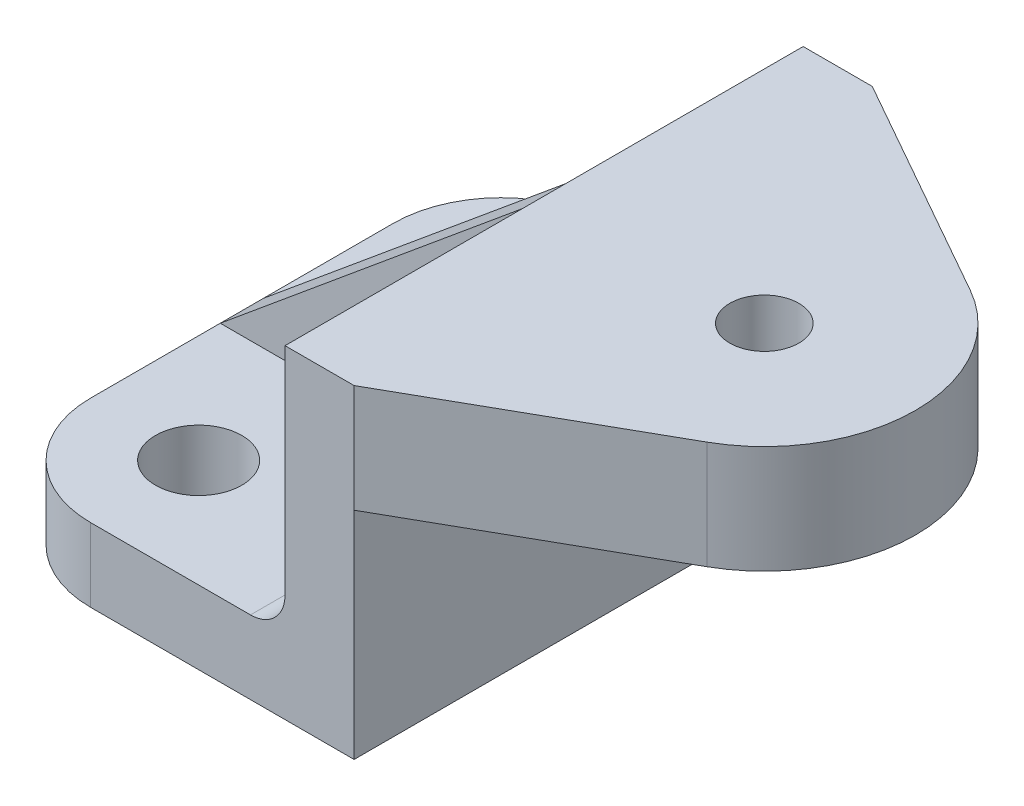
ISO-10303-21;
HEADER;
FILE_DESCRIPTION(('STEP AP214'),'2;1');
FILE_NAME('part.step','',(''),(''),'','','');
FILE_SCHEMA(('AUTOMOTIVE_DESIGN { 1 0 10303 214 1 1 1 1 }'));
ENDSEC;
DATA;
#1=APPLICATION_CONTEXT('core data for automotive mechanical design processes');
#2=APPLICATION_PROTOCOL_DEFINITION('international standard','automotive_design',2000,#1);
#3=PRODUCT_CONTEXT('',#1,'mechanical');
#4=PRODUCT('Part','Part','',(#3));
#5=PRODUCT_RELATED_PRODUCT_CATEGORY('part','',(#4));
#6=PRODUCT_DEFINITION_FORMATION('','',#4);
#7=PRODUCT_DEFINITION_CONTEXT('part definition',#1,'design');
#8=PRODUCT_DEFINITION('design','',#6,#7);
#9=PRODUCT_DEFINITION_SHAPE('','',#8);
#10=(LENGTH_UNIT() NAMED_UNIT(*) SI_UNIT(.MILLI.,.METRE.));
#11=(NAMED_UNIT(*) PLANE_ANGLE_UNIT() SI_UNIT($,.RADIAN.));
#12=(NAMED_UNIT(*) SI_UNIT($,.STERADIAN.) SOLID_ANGLE_UNIT());
#13=UNCERTAINTY_MEASURE_WITH_UNIT(LENGTH_MEASURE(1.E-05),#10,'distance_accuracy_value','');
#14=(GEOMETRIC_REPRESENTATION_CONTEXT(3) GLOBAL_UNCERTAINTY_ASSIGNED_CONTEXT((#13)) GLOBAL_UNIT_ASSIGNED_CONTEXT((#10,
#11,#12)) REPRESENTATION_CONTEXT('',''));
#15=CARTESIAN_POINT('',(0.,0.,0.));
#16=DIRECTION('',(0.,0.,1.));
#17=DIRECTION('',(1.,0.,0.));
#18=AXIS2_PLACEMENT_3D('',#15,#16,#17);
#19=CARTESIAN_POINT('',(70.,75.,-65.));
#20=DIRECTION('',(-0.638017864750323,0.770021560905562,0.));
#21=DIRECTION('',(-0.770021560905562,-0.638017864750323,0.));
#22=AXIS2_PLACEMENT_3D('',#19,#20,#21);
#23=PLANE('',#22);
#24=DIRECTION('',(0.,0.,1.));
#25=VECTOR('',#24,1.);
#26=CARTESIAN_POINT('',(0.,17.,-65.));
#27=LINE('',#26,#25);
#28=CARTESIAN_POINT('',(0.,17.,-65.));
#29=VERTEX_POINT('',#28);
#30=CARTESIAN_POINT('',(0.,17.,-55.));
#31=VERTEX_POINT('',#30);
#32=EDGE_CURVE('E180',#29,#31,#27,.T.);
#33=ORIENTED_EDGE('',*,*,#32,.T.);
#34=DIRECTION('',(-0.770021560905562,-0.638017864750323,0.));
#35=VECTOR('',#34,1.);
#36=CARTESIAN_POINT('',(0.,17.,-55.));
#37=LINE('',#36,#35);
#38=CARTESIAN_POINT('',(70.,75.,-55.));
#39=VERTEX_POINT('',#38);
#40=EDGE_CURVE('E166',#39,#31,#37,.T.);
#41=ORIENTED_EDGE('',*,*,#40,.F.);
#42=DIRECTION('',(0.,0.,1.));
#43=VECTOR('',#42,1.);
#44=CARTESIAN_POINT('',(70.,75.,-65.));
#45=LINE('',#44,#43);
#46=CARTESIAN_POINT('',(70.,75.,-65.));
#47=VERTEX_POINT('',#46);
#48=EDGE_CURVE('E194',#47,#39,#45,.T.);
#49=ORIENTED_EDGE('',*,*,#48,.F.);
#50=DIRECTION('',(-0.770021560905562,-0.638017864750323,0.));
#51=VECTOR('',#50,1.);
#52=CARTESIAN_POINT('',(70.,75.,-65.));
#53=LINE('',#52,#51);
#54=EDGE_CURVE('E190',#47,#29,#53,.T.);
#55=ORIENTED_EDGE('',*,*,#54,.T.);
#56=EDGE_LOOP('',(#33,#41,#49,#55));
#57=FACE_BOUND('',#56,.T.);
#58=ADVANCED_FACE('F43',(#57),#23,.T.);
#59=CARTESIAN_POINT('',(86.,0.,0.));
#60=DIRECTION('',(-1.,0.,0.));
#61=DIRECTION('',(0.,0.,1.));
#62=AXIS2_PLACEMENT_3D('',#59,#60,#61);
#63=PLANE('',#62);
#64=DIRECTION('',(0.,0.,-1.));
#65=VECTOR('',#64,1.);
#66=CARTESIAN_POINT('',(86.,50.,0.));
#67=LINE('',#66,#65);
#68=CARTESIAN_POINT('',(86.,50.,0.));
#69=VERTEX_POINT('',#68);
#70=CARTESIAN_POINT('',(86.,50.,-120.));
#71=VERTEX_POINT('',#70);
#72=EDGE_CURVE('E210',#69,#71,#67,.T.);
#73=ORIENTED_EDGE('',*,*,#72,.F.);
#74=DIRECTION('',(0.,-1.,0.));
#75=VECTOR('',#74,1.);
#76=CARTESIAN_POINT('',(86.,0.,0.));
#77=LINE('',#76,#75);
#78=CARTESIAN_POINT('',(86.,0.,0.));
#79=VERTEX_POINT('',#78);
#80=EDGE_CURVE('E266',#69,#79,#77,.T.);
#81=ORIENTED_EDGE('',*,*,#80,.T.);
#82=DIRECTION('',(0.,0.,-1.));
#83=VECTOR('',#82,1.);
#84=CARTESIAN_POINT('',(86.,0.,0.));
#85=LINE('',#84,#83);
#86=CARTESIAN_POINT('',(86.,0.,-120.));
#87=VERTEX_POINT('',#86);
#88=EDGE_CURVE('E265',#79,#87,#85,.T.);
#89=ORIENTED_EDGE('',*,*,#88,.T.);
#90=DIRECTION('',(0.,1.,0.));
#91=VECTOR('',#90,1.);
#92=CARTESIAN_POINT('',(86.,0.,-120.));
#93=LINE('',#92,#91);
#94=EDGE_CURVE('E269',#87,#71,#93,.T.);
#95=ORIENTED_EDGE('',*,*,#94,.T.);
#96=EDGE_LOOP('',(#73,#81,#89,#95));
#97=FACE_BOUND('',#96,.T.);
#98=ADVANCED_FACE('F352',(#97),#63,.F.);
#99=CARTESIAN_POINT('',(86.,0.,0.));
#100=DIRECTION('',(0.,0.,-1.));
#101=DIRECTION('',(-1.,0.,0.));
#102=AXIS2_PLACEMENT_3D('',#99,#100,#101);
#103=PLANE('',#102);
#104=DIRECTION('',(0.,1.,0.));
#105=VECTOR('',#104,1.);
#106=CARTESIAN_POINT('',(70.,75.,0.));
#107=LINE('',#106,#105);
#108=CARTESIAN_POINT('',(70.,25.,0.));
#109=VERTEX_POINT('',#108);
#110=CARTESIAN_POINT('',(70.,75.,0.));
#111=VERTEX_POINT('',#110);
#112=EDGE_CURVE('E163',#109,#111,#107,.T.);
#113=ORIENTED_EDGE('',*,*,#112,.F.);
#114=CARTESIAN_POINT('',(62.,25.,0.));
#115=DIRECTION('',(0.,0.,-1.));
#116=DIRECTION('',(-1.,0.,0.));
#117=AXIS2_PLACEMENT_3D('',#114,#115,#116);
#118=CIRCLE('',#117,8.);
#119=CARTESIAN_POINT('',(62.,17.,0.));
#120=VERTEX_POINT('',#119);
#121=EDGE_CURVE('E11',#109,#120,#118,.T.);
#122=ORIENTED_EDGE('',*,*,#121,.T.);
#123=DIRECTION('',(1.,0.,0.));
#124=VECTOR('',#123,1.);
#125=CARTESIAN_POINT('',(70.,17.,0.));
#126=LINE('',#125,#124);
#127=CARTESIAN_POINT('',(25.,17.,0.));
#128=VERTEX_POINT('',#127);
#129=EDGE_CURVE('E439',#128,#120,#126,.T.);
#130=ORIENTED_EDGE('',*,*,#129,.F.);
#131=DIRECTION('',(0.,-1.,0.));
#132=VECTOR('',#131,1.);
#133=CARTESIAN_POINT('',(25.,0.,0.));
#134=LINE('',#133,#132);
#135=CARTESIAN_POINT('',(25.,0.,0.));
#136=VERTEX_POINT('',#135);
#137=EDGE_CURVE('E289',#128,#136,#134,.T.);
#138=ORIENTED_EDGE('',*,*,#137,.T.);
#139=DIRECTION('',(-1.,0.,0.));
#140=VECTOR('',#139,1.);
#141=CARTESIAN_POINT('',(86.,0.,0.));
#142=LINE('',#141,#140);
#143=EDGE_CURVE('E285',#79,#136,#142,.T.);
#144=ORIENTED_EDGE('',*,*,#143,.F.);
#145=ORIENTED_EDGE('',*,*,#80,.F.);
#146=CARTESIAN_POINT('',(86.,75.,0.));
#147=VERTEX_POINT('',#146);
#148=EDGE_CURVE('E261',#147,#69,#77,.T.);
#149=ORIENTED_EDGE('',*,*,#148,.F.);
#150=DIRECTION('',(1.,0.,0.));
#151=VECTOR('',#150,1.);
#152=CARTESIAN_POINT('',(70.,75.,0.));
#153=LINE('',#152,#151);
#154=EDGE_CURVE('E254',#111,#147,#153,.T.);
#155=ORIENTED_EDGE('',*,*,#154,.F.);
#156=EDGE_LOOP('',(#113,#122,#130,#138,#144,#145,#149,#155));
#157=FACE_BOUND('',#156,.T.);
#158=ADVANCED_FACE('F357',(#157),#103,.F.);
#159=CARTESIAN_POINT('',(86.,0.,0.));
#160=DIRECTION('',(0.,1.,0.));
#161=DIRECTION('',(0.,0.,1.));
#162=AXIS2_PLACEMENT_3D('',#159,#160,#161);
#163=PLANE('',#162);
#164=CARTESIAN_POINT('',(25.,0.,-25.));
#165=DIRECTION('',(0.,1.,0.));
#166=DIRECTION('',(0.,0.,1.));
#167=AXIS2_PLACEMENT_3D('',#164,#165,#166);
#168=CIRCLE('',#167,10.);
#169=CARTESIAN_POINT('',(25.,0.,-15.));
#170=VERTEX_POINT('',#169);
#171=EDGE_CURVE('E450',#170,#170,#168,.T.);
#172=ORIENTED_EDGE('',*,*,#171,.T.);
#173=EDGE_LOOP('',(#172));
#174=FACE_BOUND('',#173,.T.);
#175=CARTESIAN_POINT('',(25.,0.,-95.));
#176=DIRECTION('',(0.,1.,0.));
#177=DIRECTION('',(0.,0.,1.));
#178=AXIS2_PLACEMENT_3D('',#175,#176,#177);
#179=CIRCLE('',#178,10.);
#180=CARTESIAN_POINT('',(25.,0.,-85.));
#181=VERTEX_POINT('',#180);
#182=EDGE_CURVE('E441',#181,#181,#179,.T.);
#183=ORIENTED_EDGE('',*,*,#182,.T.);
#184=EDGE_LOOP('',(#183));
#185=FACE_BOUND('',#184,.T.);
#186=DIRECTION('',(0.,0.,-1.));
#187=VECTOR('',#186,1.);
#188=CARTESIAN_POINT('',(0.,0.,0.));
#189=LINE('',#188,#187);
#190=CARTESIAN_POINT('',(0.,0.,-25.));
#191=VERTEX_POINT('',#190);
#192=CARTESIAN_POINT('',(0.,0.,-95.));
#193=VERTEX_POINT('',#192);
#194=EDGE_CURVE('E258',#191,#193,#189,.T.);
#195=ORIENTED_EDGE('',*,*,#194,.T.);
#196=CARTESIAN_POINT('',(25.,0.,-95.));
#197=DIRECTION('',(0.,1.,0.));
#198=DIRECTION('',(0.,0.,1.));
#199=AXIS2_PLACEMENT_3D('',#196,#197,#198);
#200=CIRCLE('',#199,25.);
#201=CARTESIAN_POINT('',(25.,0.,-120.));
#202=VERTEX_POINT('',#201);
#203=EDGE_CURVE('E311',#193,#202,#200,.F.);
#204=ORIENTED_EDGE('',*,*,#203,.T.);
#205=DIRECTION('',(-1.,0.,0.));
#206=VECTOR('',#205,1.);
#207=CARTESIAN_POINT('',(86.,0.,-120.));
#208=LINE('',#207,#206);
#209=EDGE_CURVE('E281',#87,#202,#208,.T.);
#210=ORIENTED_EDGE('',*,*,#209,.F.);
#211=ORIENTED_EDGE('',*,*,#88,.F.);
#212=ORIENTED_EDGE('',*,*,#143,.T.);
#213=CARTESIAN_POINT('',(25.,0.,-25.));
#214=DIRECTION('',(0.,1.,0.));
#215=DIRECTION('',(0.,0.,1.));
#216=AXIS2_PLACEMENT_3D('',#213,#214,#215);
#217=CIRCLE('',#216,25.);
#218=EDGE_CURVE('E293',#136,#191,#217,.F.);
#219=ORIENTED_EDGE('',*,*,#218,.T.);
#220=EDGE_LOOP('',(#195,#204,#210,#211,#212,#219));
#221=FACE_BOUND('',#220,.T.);
#222=ADVANCED_FACE('F402',(#174,#185,#221),#163,.F.);
#223=CARTESIAN_POINT('',(86.,0.,-120.));
#224=DIRECTION('',(0.,0.,1.));
#225=DIRECTION('',(1.,0.,0.));
#226=AXIS2_PLACEMENT_3D('',#223,#224,#225);
#227=PLANE('',#226);
#228=ORIENTED_EDGE('',*,*,#209,.T.);
#229=DIRECTION('',(0.,1.,0.));
#230=VECTOR('',#229,1.);
#231=CARTESIAN_POINT('',(25.,17.,-120.));
#232=LINE('',#231,#230);
#233=CARTESIAN_POINT('',(25.,17.,-120.));
#234=VERTEX_POINT('',#233);
#235=EDGE_CURVE('E301',#202,#234,#232,.T.);
#236=ORIENTED_EDGE('',*,*,#235,.T.);
#237=DIRECTION('',(-1.,0.,0.));
#238=VECTOR('',#237,1.);
#239=CARTESIAN_POINT('',(86.,17.,-120.));
#240=LINE('',#239,#238);
#241=CARTESIAN_POINT('',(62.,17.,-120.));
#242=VERTEX_POINT('',#241);
#243=EDGE_CURVE('E272',#242,#234,#240,.T.);
#244=ORIENTED_EDGE('',*,*,#243,.F.);
#245=CARTESIAN_POINT('',(62.,25.,-120.));
#246=DIRECTION('',(0.,0.,1.));
#247=DIRECTION('',(1.,0.,0.));
#248=AXIS2_PLACEMENT_3D('',#245,#246,#247);
#249=CIRCLE('',#248,8.);
#250=CARTESIAN_POINT('',(70.,25.,-120.));
#251=VERTEX_POINT('',#250);
#252=EDGE_CURVE('E321',#242,#251,#249,.T.);
#253=ORIENTED_EDGE('',*,*,#252,.T.);
#254=DIRECTION('',(0.,1.,0.));
#255=VECTOR('',#254,1.);
#256=CARTESIAN_POINT('',(70.,0.,-120.));
#257=LINE('',#256,#255);
#258=CARTESIAN_POINT('',(70.,75.,-120.));
#259=VERTEX_POINT('',#258);
#260=EDGE_CURVE('E241',#251,#259,#257,.T.);
#261=ORIENTED_EDGE('',*,*,#260,.T.);
#262=DIRECTION('',(1.,0.,0.));
#263=VECTOR('',#262,1.);
#264=CARTESIAN_POINT('',(70.,75.,-120.));
#265=LINE('',#264,#263);
#266=CARTESIAN_POINT('',(86.,75.,-120.));
#267=VERTEX_POINT('',#266);
#268=EDGE_CURVE('E253',#259,#267,#265,.T.);
#269=ORIENTED_EDGE('',*,*,#268,.T.);
#270=DIRECTION('',(0.,1.,0.));
#271=VECTOR('',#270,1.);
#272=CARTESIAN_POINT('',(86.,50.,-120.));
#273=LINE('',#272,#271);
#274=EDGE_CURVE('E237',#71,#267,#273,.T.);
#275=ORIENTED_EDGE('',*,*,#274,.F.);
#276=ORIENTED_EDGE('',*,*,#94,.F.);
#277=EDGE_LOOP('',(#228,#236,#244,#253,#261,#269,#275,#276));
#278=FACE_BOUND('',#277,.T.);
#279=ADVANCED_FACE('F398',(#278),#227,.F.);
#280=CARTESIAN_POINT('',(86.,17.,0.));
#281=DIRECTION('',(0.,-1.,0.));
#282=DIRECTION('',(0.,0.,-1.));
#283=AXIS2_PLACEMENT_3D('',#280,#281,#282);
#284=PLANE('',#283);
#285=CARTESIAN_POINT('',(25.,17.,-95.));
#286=DIRECTION('',(0.,1.,0.));
#287=DIRECTION('',(0.,0.,1.));
#288=AXIS2_PLACEMENT_3D('',#285,#286,#287);
#289=CIRCLE('',#288,10.);
#290=CARTESIAN_POINT('',(25.,17.,-85.));
#291=VERTEX_POINT('',#290);
#292=EDGE_CURVE('E446',#291,#291,#289,.T.);
#293=ORIENTED_EDGE('',*,*,#292,.F.);
#294=EDGE_LOOP('',(#293));
#295=FACE_BOUND('',#294,.T.);
#296=DIRECTION('',(0.,0.,1.));
#297=VECTOR('',#296,1.);
#298=CARTESIAN_POINT('',(0.,17.,0.));
#299=LINE('',#298,#297);
#300=CARTESIAN_POINT('',(0.,17.,-95.));
#301=VERTEX_POINT('',#300);
#302=EDGE_CURVE('E276',#301,#29,#299,.T.);
#303=ORIENTED_EDGE('',*,*,#302,.T.);
#304=DIRECTION('',(1.,0.,0.));
#305=VECTOR('',#304,1.);
#306=CARTESIAN_POINT('',(0.,17.,-65.));
#307=LINE('',#306,#305);
#308=CARTESIAN_POINT('',(62.,17.,-65.));
#309=VERTEX_POINT('',#308);
#310=EDGE_CURVE('E201',#29,#309,#307,.T.);
#311=ORIENTED_EDGE('',*,*,#310,.T.);
#312=DIRECTION('',(0.,0.,-1.));
#313=VECTOR('',#312,1.);
#314=CARTESIAN_POINT('',(62.,17.,0.));
#315=LINE('',#314,#313);
#316=EDGE_CURVE('E314',#309,#242,#315,.T.);
#317=ORIENTED_EDGE('',*,*,#316,.T.);
#318=ORIENTED_EDGE('',*,*,#243,.T.);
#319=CARTESIAN_POINT('',(25.,17.,-95.));
#320=DIRECTION('',(0.,-1.,0.));
#321=DIRECTION('',(0.,0.,-1.));
#322=AXIS2_PLACEMENT_3D('',#319,#320,#321);
#323=CIRCLE('',#322,25.);
#324=EDGE_CURVE('E305',#234,#301,#323,.F.);
#325=ORIENTED_EDGE('',*,*,#324,.T.);
#326=EDGE_LOOP('',(#303,#311,#317,#318,#325));
#327=FACE_BOUND('',#326,.T.);
#328=ADVANCED_FACE('F395',(#295,#327),#284,.F.);
#329=CARTESIAN_POINT('',(0.,0.,0.));
#330=DIRECTION('',(-1.,0.,0.));
#331=DIRECTION('',(0.,0.,1.));
#332=AXIS2_PLACEMENT_3D('',#329,#330,#331);
#333=PLANE('',#332);
#334=ORIENTED_EDGE('',*,*,#302,.F.);
#335=DIRECTION('',(0.,1.,0.));
#336=VECTOR('',#335,1.);
#337=CARTESIAN_POINT('',(0.,0.,-95.));
#338=LINE('',#337,#336);
#339=EDGE_CURVE('E308',#301,#193,#338,.F.);
#340=ORIENTED_EDGE('',*,*,#339,.T.);
#341=ORIENTED_EDGE('',*,*,#194,.F.);
#342=DIRECTION('',(0.,-1.,0.));
#343=VECTOR('',#342,1.);
#344=CARTESIAN_POINT('',(0.,17.,-25.));
#345=LINE('',#344,#343);
#346=CARTESIAN_POINT('',(0.,17.,-25.));
#347=VERTEX_POINT('',#346);
#348=EDGE_CURVE('E184',#191,#347,#345,.F.);
#349=ORIENTED_EDGE('',*,*,#348,.T.);
#350=DIRECTION('',(0.,0.,1.));
#351=VECTOR('',#350,1.);
#352=CARTESIAN_POINT('',(0.,17.,-55.));
#353=LINE('',#352,#351);
#354=EDGE_CURVE('E157',#31,#347,#353,.T.);
#355=ORIENTED_EDGE('',*,*,#354,.F.);
#356=ORIENTED_EDGE('',*,*,#32,.F.);
#357=EDGE_LOOP('',(#334,#340,#341,#349,#355,#356));
#358=FACE_BOUND('',#357,.T.);
#359=ADVANCED_FACE('F179',(#358),#333,.T.);
#360=CARTESIAN_POINT('',(70.,0.,0.));
#361=DIRECTION('',(-1.,0.,0.));
#362=DIRECTION('',(0.,0.,1.));
#363=AXIS2_PLACEMENT_3D('',#360,#361,#362);
#364=PLANE('',#363);
#365=DIRECTION('',(0.,1.,0.));
#366=VECTOR('',#365,1.);
#367=CARTESIAN_POINT('',(70.,17.,-65.));
#368=LINE('',#367,#366);
#369=CARTESIAN_POINT('',(70.,25.,-65.));
#370=VERTEX_POINT('',#369);
#371=EDGE_CURVE('E187',#370,#47,#368,.T.);
#372=ORIENTED_EDGE('',*,*,#371,.T.);
#373=DIRECTION('',(0.,0.,1.));
#374=VECTOR('',#373,1.);
#375=CARTESIAN_POINT('',(70.,75.,0.));
#376=LINE('',#375,#374);
#377=EDGE_CURVE('E249',#259,#47,#376,.T.);
#378=ORIENTED_EDGE('',*,*,#377,.F.);
#379=ORIENTED_EDGE('',*,*,#260,.F.);
#380=DIRECTION('',(0.,0.,-1.));
#381=VECTOR('',#380,1.);
#382=CARTESIAN_POINT('',(70.,25.,0.));
#383=LINE('',#382,#381);
#384=EDGE_CURVE('E317',#251,#370,#383,.F.);
#385=ORIENTED_EDGE('',*,*,#384,.T.);
#386=EDGE_LOOP('',(#372,#378,#379,#385));
#387=FACE_BOUND('',#386,.T.);
#388=ADVANCED_FACE('F386',(#387),#364,.T.);
#389=CARTESIAN_POINT('',(70.,75.,0.));
#390=DIRECTION('',(0.,1.,0.));
#391=DIRECTION('',(0.,0.,1.));
#392=AXIS2_PLACEMENT_3D('',#389,#390,#391);
#393=PLANE('',#392);
#394=CARTESIAN_POINT('',(121.,75.,-60.));
#395=DIRECTION('',(0.,1.,0.));
#396=DIRECTION('',(0.,0.,1.));
#397=AXIS2_PLACEMENT_3D('',#394,#395,#396);
#398=CIRCLE('',#397,8.00000000000001);
#399=CARTESIAN_POINT('',(121.,75.,-52.));
#400=VERTEX_POINT('',#399);
#401=EDGE_CURVE('E193',#400,#400,#398,.T.);
#402=ORIENTED_EDGE('',*,*,#401,.F.);
#403=EDGE_LOOP('',(#402));
#404=FACE_BOUND('',#403,.T.);
#405=ORIENTED_EDGE('',*,*,#154,.T.);
#406=DIRECTION('',(0.870466321243524,0.,-0.492227979274611));
#407=VECTOR('',#406,1.);
#408=CARTESIAN_POINT('',(20.836800987946,75.,36.8482375365781));
#409=LINE('',#408,#407);
#410=CARTESIAN_POINT('',(138.227979274611,75.,-29.5336787564767));
#411=VERTEX_POINT('',#410);
#412=EDGE_CURVE('E208',#147,#411,#409,.T.);
#413=ORIENTED_EDGE('',*,*,#412,.T.);
#414=CARTESIAN_POINT('',(121.,75.,-60.));
#415=DIRECTION('',(0.,1.,0.));
#416=DIRECTION('',(0.,0.,1.));
#417=AXIS2_PLACEMENT_3D('',#414,#415,#416);
#418=CIRCLE('',#417,35.);
#419=CARTESIAN_POINT('',(138.227979274611,75.,-90.4663212435234));
#420=VERTEX_POINT('',#419);
#421=EDGE_CURVE('E230',#411,#420,#418,.T.);
#422=ORIENTED_EDGE('',*,*,#421,.T.);
#423=DIRECTION('',(0.870466321243523,0.,0.492227979274611));
#424=VECTOR('',#423,1.);
#425=CARTESIAN_POINT('',(72.2529463878225,75.,-127.773631506886));
#426=LINE('',#425,#424);
#427=EDGE_CURVE('E215',#267,#420,#426,.T.);
#428=ORIENTED_EDGE('',*,*,#427,.F.);
#429=ORIENTED_EDGE('',*,*,#268,.F.);
#430=ORIENTED_EDGE('',*,*,#377,.T.);
#431=ORIENTED_EDGE('',*,*,#48,.T.);
#432=DIRECTION('',(0.,0.,1.));
#433=VECTOR('',#432,1.);
#434=CARTESIAN_POINT('',(70.,75.,-55.));
#435=LINE('',#434,#433);
#436=EDGE_CURVE('E174',#39,#111,#435,.T.);
#437=ORIENTED_EDGE('',*,*,#436,.T.);
#438=EDGE_LOOP('',(#405,#413,#422,#428,#429,#430,#431,#437));
#439=FACE_BOUND('',#438,.T.);
#440=ADVANCED_FACE('F378',(#404,#439),#393,.T.);
#441=CARTESIAN_POINT('',(72.2529463878225,50.,-127.773631506886));
#442=DIRECTION('',(-0.492227979274611,0.,0.870466321243524));
#443=DIRECTION('',(0.870466321243523,0.,0.492227979274611));
#444=AXIS2_PLACEMENT_3D('',#441,#442,#443);
#445=PLANE('',#444);
#446=ORIENTED_EDGE('',*,*,#427,.T.);
#447=DIRECTION('',(0.,1.,0.));
#448=VECTOR('',#447,1.);
#449=CARTESIAN_POINT('',(138.227979274611,50.,-90.4663212435234));
#450=LINE('',#449,#448);
#451=CARTESIAN_POINT('',(138.227979274611,50.,-90.4663212435234));
#452=VERTEX_POINT('',#451);
#453=EDGE_CURVE('E242',#452,#420,#450,.T.);
#454=ORIENTED_EDGE('',*,*,#453,.F.);
#455=DIRECTION('',(0.870466321243523,0.,0.492227979274611));
#456=VECTOR('',#455,1.);
#457=CARTESIAN_POINT('',(72.2529463878225,50.,-127.773631506886));
#458=LINE('',#457,#456);
#459=EDGE_CURVE('E223',#71,#452,#458,.T.);
#460=ORIENTED_EDGE('',*,*,#459,.F.);
#461=ORIENTED_EDGE('',*,*,#274,.T.);
#462=EDGE_LOOP('',(#446,#454,#460,#461));
#463=FACE_BOUND('',#462,.T.);
#464=ADVANCED_FACE('F374',(#463),#445,.F.);
#465=CARTESIAN_POINT('',(121.,50.,-60.));
#466=DIRECTION('',(0.,1.,0.));
#467=DIRECTION('',(0.,0.,1.));
#468=AXIS2_PLACEMENT_3D('',#465,#466,#467);
#469=CYLINDRICAL_SURFACE('',#468,35.);
#470=ORIENTED_EDGE('',*,*,#421,.F.);
#471=DIRECTION('',(0.,1.,0.));
#472=VECTOR('',#471,1.);
#473=CARTESIAN_POINT('',(138.227979274611,50.,-29.5336787564767));
#474=LINE('',#473,#472);
#475=CARTESIAN_POINT('',(138.227979274611,50.,-29.5336787564767));
#476=VERTEX_POINT('',#475);
#477=EDGE_CURVE('E226',#476,#411,#474,.T.);
#478=ORIENTED_EDGE('',*,*,#477,.F.);
#479=CARTESIAN_POINT('',(121.,50.,-60.));
#480=DIRECTION('',(0.,1.,0.));
#481=DIRECTION('',(0.,0.,1.));
#482=AXIS2_PLACEMENT_3D('',#479,#480,#481);
#483=CIRCLE('',#482,35.);
#484=EDGE_CURVE('E219',#476,#452,#483,.T.);
#485=ORIENTED_EDGE('',*,*,#484,.T.);
#486=ORIENTED_EDGE('',*,*,#453,.T.);
#487=EDGE_LOOP('',(#470,#478,#485,#486));
#488=FACE_BOUND('',#487,.T.);
#489=ADVANCED_FACE('F377',(#488),#469,.T.);
#490=CARTESIAN_POINT('',(20.836800987946,50.,36.8482375365781));
#491=DIRECTION('',(0.492227979274611,0.,0.870466321243523));
#492=DIRECTION('',(0.870466321243524,0.,-0.492227979274611));
#493=AXIS2_PLACEMENT_3D('',#490,#491,#492);
#494=PLANE('',#493);
#495=ORIENTED_EDGE('',*,*,#412,.F.);
#496=ORIENTED_EDGE('',*,*,#148,.T.);
#497=DIRECTION('',(0.870466321243524,0.,-0.492227979274611));
#498=VECTOR('',#497,1.);
#499=CARTESIAN_POINT('',(20.836800987946,50.,36.8482375365781));
#500=LINE('',#499,#498);
#501=EDGE_CURVE('E214',#69,#476,#500,.T.);
#502=ORIENTED_EDGE('',*,*,#501,.T.);
#503=ORIENTED_EDGE('',*,*,#477,.T.);
#504=EDGE_LOOP('',(#495,#496,#502,#503));
#505=FACE_BOUND('',#504,.T.);
#506=ADVANCED_FACE('F372',(#505),#494,.T.);
#507=CARTESIAN_POINT('',(0.,50.,0.));
#508=DIRECTION('',(0.,1.,0.));
#509=DIRECTION('',(0.,0.,1.));
#510=AXIS2_PLACEMENT_3D('',#507,#508,#509);
#511=PLANE('',#510);
#512=CARTESIAN_POINT('',(121.,50.,-60.));
#513=DIRECTION('',(0.,1.,0.));
#514=DIRECTION('',(0.,0.,1.));
#515=AXIS2_PLACEMENT_3D('',#512,#513,#514);
#516=CIRCLE('',#515,8.00000000000001);
#517=CARTESIAN_POINT('',(121.,50.,-52.));
#518=VERTEX_POINT('',#517);
#519=EDGE_CURVE('E199',#518,#518,#516,.T.);
#520=ORIENTED_EDGE('',*,*,#519,.T.);
#521=EDGE_LOOP('',(#520));
#522=FACE_BOUND('',#521,.T.);
#523=ORIENTED_EDGE('',*,*,#72,.T.);
#524=ORIENTED_EDGE('',*,*,#459,.T.);
#525=ORIENTED_EDGE('',*,*,#484,.F.);
#526=ORIENTED_EDGE('',*,*,#501,.F.);
#527=EDGE_LOOP('',(#523,#524,#525,#526));
#528=FACE_BOUND('',#527,.T.);
#529=ADVANCED_FACE('F368',(#522,#528),#511,.F.);
#530=CARTESIAN_POINT('',(121.,50.,-60.));
#531=DIRECTION('',(0.,1.,0.));
#532=DIRECTION('',(0.,0.,1.));
#533=AXIS2_PLACEMENT_3D('',#530,#531,#532);
#534=CYLINDRICAL_SURFACE('',#533,8.00000000000001);
#535=ORIENTED_EDGE('',*,*,#519,.F.);
#536=EDGE_LOOP('',(#535));
#537=FACE_BOUND('',#536,.T.);
#538=ORIENTED_EDGE('',*,*,#401,.T.);
#539=EDGE_LOOP('',(#538));
#540=FACE_BOUND('',#539,.T.);
#541=ADVANCED_FACE('F364',(#537,#540),#534,.F.);
#542=CARTESIAN_POINT('',(25.,0.,-25.));
#543=DIRECTION('',(0.,1.,0.));
#544=DIRECTION('',(0.,0.,1.));
#545=AXIS2_PLACEMENT_3D('',#542,#543,#544);
#546=CYLINDRICAL_SURFACE('',#545,25.);
#547=CARTESIAN_POINT('',(25.,17.,-25.));
#548=DIRECTION('',(0.,-1.,0.));
#549=DIRECTION('',(0.,0.,-1.));
#550=AXIS2_PLACEMENT_3D('',#547,#548,#549);
#551=CIRCLE('',#550,25.);
#552=EDGE_CURVE('E298',#347,#128,#551,.F.);
#553=ORIENTED_EDGE('',*,*,#552,.F.);
#554=ORIENTED_EDGE('',*,*,#348,.F.);
#555=ORIENTED_EDGE('',*,*,#218,.F.);
#556=ORIENTED_EDGE('',*,*,#137,.F.);
#557=EDGE_LOOP('',(#553,#554,#555,#556));
#558=FACE_BOUND('',#557,.T.);
#559=ADVANCED_FACE('F367',(#558),#546,.T.);
#560=CARTESIAN_POINT('',(25.,0.,-95.));
#561=DIRECTION('',(0.,-1.,0.));
#562=DIRECTION('',(0.,0.,-1.));
#563=AXIS2_PLACEMENT_3D('',#560,#561,#562);
#564=CYLINDRICAL_SURFACE('',#563,25.);
#565=ORIENTED_EDGE('',*,*,#203,.F.);
#566=ORIENTED_EDGE('',*,*,#339,.F.);
#567=ORIENTED_EDGE('',*,*,#324,.F.);
#568=ORIENTED_EDGE('',*,*,#235,.F.);
#569=EDGE_LOOP('',(#565,#566,#567,#568));
#570=FACE_BOUND('',#569,.T.);
#571=ADVANCED_FACE('F411',(#570),#564,.T.);
#572=CARTESIAN_POINT('',(62.,25.,0.));
#573=DIRECTION('',(0.,0.,-1.));
#574=DIRECTION('',(-1.,0.,0.));
#575=AXIS2_PLACEMENT_3D('',#572,#573,#574);
#576=CYLINDRICAL_SURFACE('',#575,8.);
#577=ORIENTED_EDGE('',*,*,#316,.F.);
#578=CARTESIAN_POINT('',(62.,25.,-65.));
#579=DIRECTION('',(0.,0.,-1.));
#580=DIRECTION('',(-1.,0.,0.));
#581=AXIS2_PLACEMENT_3D('',#578,#579,#580);
#582=CIRCLE('',#581,8.);
#583=EDGE_CURVE('E324',#309,#370,#582,.F.);
#584=ORIENTED_EDGE('',*,*,#583,.T.);
#585=ORIENTED_EDGE('',*,*,#384,.F.);
#586=ORIENTED_EDGE('',*,*,#252,.F.);
#587=EDGE_LOOP('',(#577,#584,#585,#586));
#588=FACE_BOUND('',#587,.T.);
#589=ADVANCED_FACE('F414',(#588),#576,.F.);
#590=CARTESIAN_POINT('',(0.,0.,-65.));
#591=DIRECTION('',(0.,0.,-1.));
#592=DIRECTION('',(-1.,0.,0.));
#593=AXIS2_PLACEMENT_3D('',#590,#591,#592);
#594=PLANE('',#593);
#595=ORIENTED_EDGE('',*,*,#583,.F.);
#596=ORIENTED_EDGE('',*,*,#310,.F.);
#597=ORIENTED_EDGE('',*,*,#54,.F.);
#598=ORIENTED_EDGE('',*,*,#371,.F.);
#599=EDGE_LOOP('',(#595,#596,#597,#598));
#600=FACE_BOUND('',#599,.T.);
#601=ADVANCED_FACE('F362',(#600),#594,.T.);
#602=CARTESIAN_POINT('',(70.,17.,-55.));
#603=DIRECTION('',(0.,-1.,0.));
#604=DIRECTION('',(1.,0.,0.));
#605=AXIS2_PLACEMENT_3D('',#602,#603,#604);
#606=PLANE('',#605);
#607=CARTESIAN_POINT('',(25.,17.,-25.));
#608=DIRECTION('',(0.,1.,0.));
#609=DIRECTION('',(-1.,0.,0.));
#610=AXIS2_PLACEMENT_3D('',#607,#608,#609);
#611=CIRCLE('',#610,10.);
#612=CARTESIAN_POINT('',(15.,17.,-25.));
#613=VERTEX_POINT('',#612);
#614=EDGE_CURVE('E454',#613,#613,#611,.T.);
#615=ORIENTED_EDGE('',*,*,#614,.F.);
#616=EDGE_LOOP('',(#615));
#617=FACE_BOUND('',#616,.T.);
#618=ORIENTED_EDGE('',*,*,#129,.T.);
#619=DIRECTION('',(0.,0.,1.));
#620=VECTOR('',#619,1.);
#621=CARTESIAN_POINT('',(62.,17.,-55.));
#622=LINE('',#621,#620);
#623=CARTESIAN_POINT('',(62.,17.,-55.));
#624=VERTEX_POINT('',#623);
#625=EDGE_CURVE('E59',#120,#624,#622,.F.);
#626=ORIENTED_EDGE('',*,*,#625,.T.);
#627=DIRECTION('',(1.,0.,0.));
#628=VECTOR('',#627,1.);
#629=CARTESIAN_POINT('',(70.,17.,-55.));
#630=LINE('',#629,#628);
#631=EDGE_CURVE('E153',#31,#624,#630,.T.);
#632=ORIENTED_EDGE('',*,*,#631,.F.);
#633=ORIENTED_EDGE('',*,*,#354,.T.);
#634=ORIENTED_EDGE('',*,*,#552,.T.);
#635=EDGE_LOOP('',(#618,#626,#632,#633,#634));
#636=FACE_BOUND('',#635,.T.);
#637=ADVANCED_FACE('F155',(#617,#636),#606,.F.);
#638=CARTESIAN_POINT('',(70.,75.,-55.));
#639=DIRECTION('',(1.,0.,0.));
#640=DIRECTION('',(0.,0.,-1.));
#641=AXIS2_PLACEMENT_3D('',#638,#639,#640);
#642=PLANE('',#641);
#643=DIRECTION('',(0.,1.,0.));
#644=VECTOR('',#643,1.);
#645=CARTESIAN_POINT('',(70.,75.,-55.));
#646=LINE('',#645,#644);
#647=CARTESIAN_POINT('',(70.,25.,-55.));
#648=VERTEX_POINT('',#647);
#649=EDGE_CURVE('E162',#648,#39,#646,.T.);
#650=ORIENTED_EDGE('',*,*,#649,.F.);
#651=DIRECTION('',(0.,0.,1.));
#652=VECTOR('',#651,1.);
#653=CARTESIAN_POINT('',(70.,25.,0.));
#654=LINE('',#653,#652);
#655=EDGE_CURVE('E328',#648,#109,#654,.T.);
#656=ORIENTED_EDGE('',*,*,#655,.T.);
#657=ORIENTED_EDGE('',*,*,#112,.T.);
#658=ORIENTED_EDGE('',*,*,#436,.F.);
#659=EDGE_LOOP('',(#650,#656,#657,#658));
#660=FACE_BOUND('',#659,.T.);
#661=ADVANCED_FACE('F337',(#660),#642,.F.);
#662=CARTESIAN_POINT('',(0.,0.,-55.));
#663=DIRECTION('',(0.,0.,1.));
#664=DIRECTION('',(1.,0.,0.));
#665=AXIS2_PLACEMENT_3D('',#662,#663,#664);
#666=PLANE('',#665);
#667=ORIENTED_EDGE('',*,*,#631,.T.);
#668=CARTESIAN_POINT('',(62.,25.,-55.));
#669=DIRECTION('',(0.,0.,1.));
#670=DIRECTION('',(1.,0.,0.));
#671=AXIS2_PLACEMENT_3D('',#668,#669,#670);
#672=CIRCLE('',#671,8.);
#673=EDGE_CURVE('E52',#624,#648,#672,.T.);
#674=ORIENTED_EDGE('',*,*,#673,.T.);
#675=ORIENTED_EDGE('',*,*,#649,.T.);
#676=ORIENTED_EDGE('',*,*,#40,.T.);
#677=EDGE_LOOP('',(#667,#674,#675,#676));
#678=FACE_BOUND('',#677,.T.);
#679=ADVANCED_FACE('F167',(#678),#666,.T.);
#680=CARTESIAN_POINT('',(62.,25.,-55.));
#681=DIRECTION('',(0.,0.,-1.));
#682=DIRECTION('',(-1.,0.,0.));
#683=AXIS2_PLACEMENT_3D('',#680,#681,#682);
#684=CYLINDRICAL_SURFACE('',#683,8.);
#685=ORIENTED_EDGE('',*,*,#673,.F.);
#686=ORIENTED_EDGE('',*,*,#625,.F.);
#687=ORIENTED_EDGE('',*,*,#121,.F.);
#688=ORIENTED_EDGE('',*,*,#655,.F.);
#689=EDGE_LOOP('',(#685,#686,#687,#688));
#690=FACE_BOUND('',#689,.T.);
#691=ADVANCED_FACE('F45',(#690),#684,.F.);
#692=CARTESIAN_POINT('',(25.,-38.,-95.));
#693=DIRECTION('',(0.,1.,0.));
#694=DIRECTION('',(0.,0.,1.));
#695=AXIS2_PLACEMENT_3D('',#692,#693,#694);
#696=CYLINDRICAL_SURFACE('',#695,10.);
#697=ORIENTED_EDGE('',*,*,#292,.T.);
#698=EDGE_LOOP('',(#697));
#699=FACE_BOUND('',#698,.T.);
#700=ORIENTED_EDGE('',*,*,#182,.F.);
#701=EDGE_LOOP('',(#700));
#702=FACE_BOUND('',#701,.T.);
#703=ADVANCED_FACE('F342',(#699,#702),#696,.F.);
#704=CARTESIAN_POINT('',(25.,-38.,-25.));
#705=DIRECTION('',(0.,1.,0.));
#706=DIRECTION('',(-1.,0.,0.));
#707=AXIS2_PLACEMENT_3D('',#704,#705,#706);
#708=CYLINDRICAL_SURFACE('',#707,10.);
#709=ORIENTED_EDGE('',*,*,#614,.T.);
#710=EDGE_LOOP('',(#709));
#711=FACE_BOUND('',#710,.T.);
#712=ORIENTED_EDGE('',*,*,#171,.F.);
#713=EDGE_LOOP('',(#712));
#714=FACE_BOUND('',#713,.T.);
#715=ADVANCED_FACE('F347',(#711,#714),#708,.F.);
#716=CLOSED_SHELL('',(#58,#98,#158,#222,#279,#328,#359,#388,#440,#464,#489,#506,#529,#541,#559,
#571,#589,#601,#637,#661,#679,#691,#703,#715));
#717=MANIFOLD_SOLID_BREP('B2',#716);
#718=ADVANCED_BREP_SHAPE_REPRESENTATION('',(#18,#717),#14);
#719=SHAPE_DEFINITION_REPRESENTATION(#9,#718);
ENDSEC;
END-ISO-10303-21;
